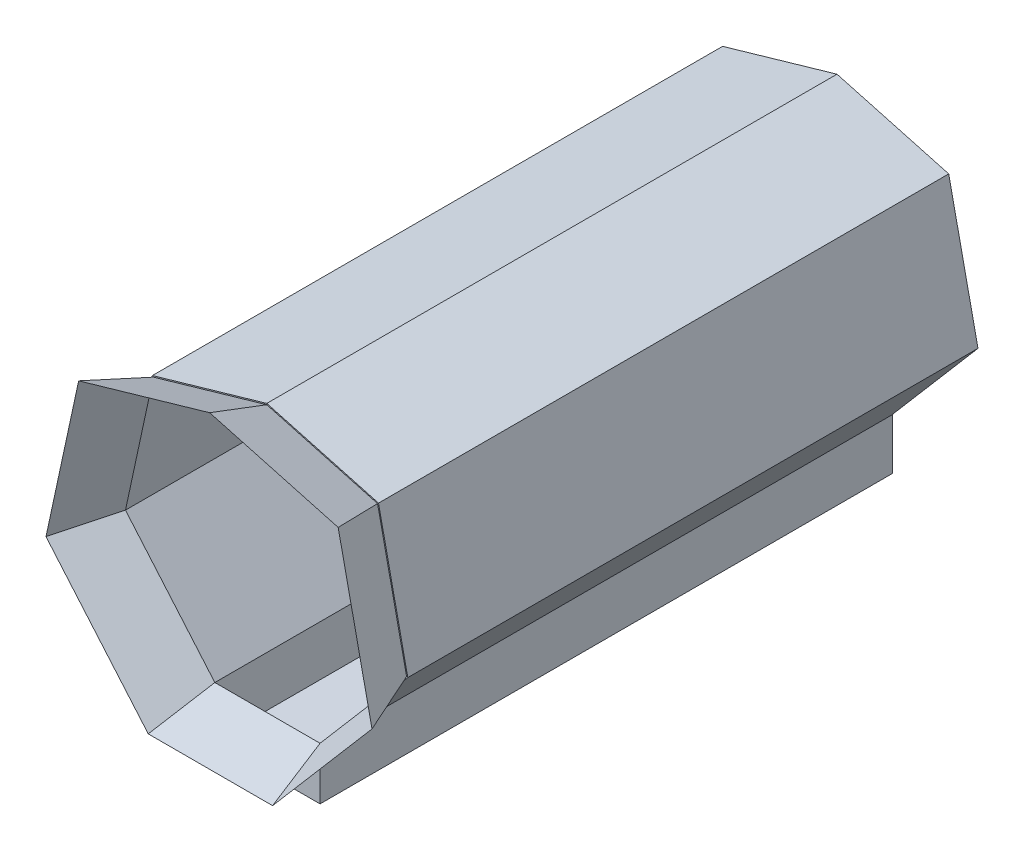
ISO-10303-21;
HEADER;
FILE_DESCRIPTION(('STEP AP214'),'2;1');
FILE_NAME('part.step','',(''),(''),'','','');
FILE_SCHEMA(('AUTOMOTIVE_DESIGN { 1 0 10303 214 1 1 1 1 }'));
ENDSEC;
DATA;
#1=APPLICATION_CONTEXT('core data for automotive mechanical design processes');
#2=APPLICATION_PROTOCOL_DEFINITION('international standard','automotive_design',2000,#1);
#3=PRODUCT_CONTEXT('',#1,'mechanical');
#4=PRODUCT('Part','Part','',(#3));
#5=PRODUCT_RELATED_PRODUCT_CATEGORY('part','',(#4));
#6=PRODUCT_DEFINITION_FORMATION('','',#4);
#7=PRODUCT_DEFINITION_CONTEXT('part definition',#1,'design');
#8=PRODUCT_DEFINITION('design','',#6,#7);
#9=PRODUCT_DEFINITION_SHAPE('','',#8);
#10=(LENGTH_UNIT() NAMED_UNIT(*) SI_UNIT(.MILLI.,.METRE.));
#11=(NAMED_UNIT(*) PLANE_ANGLE_UNIT() SI_UNIT($,.RADIAN.));
#12=(NAMED_UNIT(*) SI_UNIT($,.STERADIAN.) SOLID_ANGLE_UNIT());
#13=UNCERTAINTY_MEASURE_WITH_UNIT(LENGTH_MEASURE(1.E-05),#10,'distance_accuracy_value','');
#14=(GEOMETRIC_REPRESENTATION_CONTEXT(3) GLOBAL_UNCERTAINTY_ASSIGNED_CONTEXT((#13)) GLOBAL_UNIT_ASSIGNED_CONTEXT((#10,
#11,#12)) REPRESENTATION_CONTEXT('',''));
#15=CARTESIAN_POINT('',(0.,0.,0.));
#16=DIRECTION('',(0.,0.,1.));
#17=DIRECTION('',(1.,0.,0.));
#18=AXIS2_PLACEMENT_3D('',#15,#16,#17);
#19=CARTESIAN_POINT('',(2670.63100520292,1349.34074992403,5000.));
#20=DIRECTION('',(0.713921634132944,-0.611014011194862,-0.342020143325669));
#21=DIRECTION('',(0.650227529384921,0.75973953433396,0.));
#22=AXIS2_PLACEMENT_3D('',#19,#20,#21);
#23=PLANE('',#22);
#24=DIRECTION('',(-0.650227529384921,-0.75973953433396,0.));
#25=VECTOR('',#24,1.);
#26=CARTESIAN_POINT('',(2670.63100520292,1349.34074992403,5000.));
#27=LINE('',#26,#25);
#28=CARTESIAN_POINT('',(2670.63100520292,1349.34074992403,5000.));
#29=VERTEX_POINT('',#28);
#30=CARTESIAN_POINT('',(1911.88754105933,462.808912872056,5000.));
#31=VERTEX_POINT('',#30);
#32=EDGE_CURVE('E178',#29,#31,#27,.T.);
#33=ORIENTED_EDGE('',*,*,#32,.F.);
#34=DIRECTION('',(-0.36474440443504,0.0924449784311128,-0.9265071210715));
#35=VECTOR('',#34,1.);
#36=CARTESIAN_POINT('',(2596.78551169436,1368.05699333072,4812.42104124753));
#37=LINE('',#36,#35);
#38=CARTESIAN_POINT('',(2867.46942993797,1299.45177641879,5500.));
#39=VERTEX_POINT('',#38);
#40=EDGE_CURVE('E13',#39,#29,#37,.T.);
#41=ORIENTED_EDGE('',*,*,#40,.F.);
#42=DIRECTION('',(-0.650227529384921,-0.75973953433396,0.));
#43=VECTOR('',#42,1.);
#44=CARTESIAN_POINT('',(1013.18147961817,-867.137302375915,5500.));
#45=LINE('',#44,#43);
#46=CARTESIAN_POINT('',(1995.6707077345,280.823795738955,5500.));
#47=VERTEX_POINT('',#46);
#48=EDGE_CURVE('E184',#39,#47,#45,.T.);
#49=ORIENTED_EDGE('',*,*,#48,.T.);
#50=DIRECTION('',(-0.15554437613408,0.337857383928939,-0.928255533340768));
#51=VECTOR('',#50,1.);
#52=CARTESIAN_POINT('',(1883.65576262018,524.131057999904,4831.51879094872));
#53=LINE('',#52,#51);
#54=EDGE_CURVE('E173',#47,#31,#53,.T.);
#55=ORIENTED_EDGE('',*,*,#54,.T.);
#56=EDGE_LOOP('',(#33,#41,#49,#55));
#57=FACE_BOUND('',#56,.T.);
#58=ADVANCED_FACE('F107',(#57),#23,.T.);
#59=CARTESIAN_POINT('',(2416.10612923576,2535.14523468048,5000.));
#60=DIRECTION('',(0.918766367009611,0.197206958324114,-0.342020143325669));
#61=DIRECTION('',(-0.348871320206438,0.,-0.937170636510458));
#62=AXIS2_PLACEMENT_3D('',#59,#60,#61);
#63=PLANE('',#62);
#64=DIRECTION('',(0.209863261626106,-0.977730745870075,0.));
#65=VECTOR('',#64,1.);
#66=CARTESIAN_POINT('',(2416.10612923576,2535.14523468048,5000.));
#67=LINE('',#66,#65);
#68=CARTESIAN_POINT('',(2416.10612923576,2535.14523468048,5000.));
#69=VERTEX_POINT('',#68);
#70=EDGE_CURVE('E150',#69,#29,#67,.T.);
#71=ORIENTED_EDGE('',*,*,#70,.F.);
#72=DIRECTION('',(-0.284651116859296,-0.269408804401264,-0.919995998785776));
#73=VECTOR('',#72,1.);
#74=CARTESIAN_POINT('',(2357.75316131961,2479.91691345338,4811.40247193664));
#75=LINE('',#74,#73);
#76=CARTESIAN_POINT('',(2570.8084960042,2681.56369995469,5500.));
#77=VERTEX_POINT('',#76);
#78=EDGE_CURVE('E115',#77,#69,#75,.T.);
#79=ORIENTED_EDGE('',*,*,#78,.F.);
#80=DIRECTION('',(0.209863261626106,-0.977730745870075,0.));
#81=VECTOR('',#80,1.);
#82=CARTESIAN_POINT('',(3007.81285601815,645.606593626322,5500.));
#83=LINE('',#82,#81);
#84=EDGE_CURVE('E123',#77,#39,#83,.T.);
#85=ORIENTED_EDGE('',*,*,#84,.T.);
#86=ORIENTED_EDGE('',*,*,#40,.T.);
#87=EDGE_LOOP('',(#71,#79,#85,#86));
#88=FACE_BOUND('',#87,.T.);
#89=ADVANCED_FACE('F108',(#88),#63,.T.);
#90=CARTESIAN_POINT('',(1445.1079348741,2800.16075996232,5000.));
#91=DIRECTION('',(0.247421394903269,0.906534541484002,-0.342020143325669));
#92=DIRECTION('',(0.,0.352995489865948,0.935625023251462));
#93=AXIS2_PLACEMENT_3D('',#90,#91,#92);
#94=PLANE('',#93);
#95=DIRECTION('',(0.964713909028918,-0.263300348891044,0.));
#96=VECTOR('',#95,1.);
#97=CARTESIAN_POINT('',(1445.1079348741,2800.16075996232,5000.));
#98=LINE('',#97,#96);
#99=CARTESIAN_POINT('',(1445.1079348741,2800.16075996232,5000.));
#100=VERTEX_POINT('',#99);
#101=EDGE_CURVE('E242',#100,#69,#98,.T.);
#102=ORIENTED_EDGE('',*,*,#101,.F.);
#103=DIRECTION('',(0.00267031261497397,-0.353632146298872,-0.935380764466852));
#104=VECTOR('',#103,1.);
#105=CARTESIAN_POINT('',(1445.3725852174,2765.11285268919,4907.29593267689));
#106=LINE('',#105,#104);
#107=CARTESIAN_POINT('',(1443.68054149784,2989.19187955159,5500.));
#108=VERTEX_POINT('',#107);
#109=EDGE_CURVE('E198',#108,#100,#106,.T.);
#110=ORIENTED_EDGE('',*,*,#109,.F.);
#111=DIRECTION('',(0.964713909028918,-0.263300348891044,0.));
#112=VECTOR('',#111,1.);
#113=CARTESIAN_POINT('',(859.369308453044,3148.6685389858,5500.));
#114=LINE('',#113,#112);
#115=EDGE_CURVE('E189',#108,#77,#114,.T.);
#116=ORIENTED_EDGE('',*,*,#115,.T.);
#117=ORIENTED_EDGE('',*,*,#78,.T.);
#118=EDGE_LOOP('',(#102,#110,#116,#117));
#119=FACE_BOUND('',#118,.T.);
#120=ADVANCED_FACE('F252',(#119),#94,.T.);
#121=CARTESIAN_POINT('',(450.137888663884,2512.38925258013,5000.));
#122=DIRECTION('',(-0.261083071054589,0.902694772095304,-0.342020143325669));
#123=DIRECTION('',(0.,0.354308872959638,0.935128452428901));
#124=AXIS2_PLACEMENT_3D('',#121,#122,#123);
#125=PLANE('',#124);
#126=DIRECTION('',(0.960627711794032,0.277838800986043,0.));
#127=VECTOR('',#126,1.);
#128=CARTESIAN_POINT('',(450.137888663884,2512.38925258013,5000.));
#129=LINE('',#128,#127);
#130=CARTESIAN_POINT('',(450.137888663884,2512.38925258013,5000.));
#131=VERTEX_POINT('',#130);
#132=EDGE_CURVE('E236',#131,#100,#129,.T.);
#133=ORIENTED_EDGE('',*,*,#132,.F.);
#134=DIRECTION('',(0.285327923975842,-0.266313006622187,-0.920687437898165));
#135=VECTOR('',#134,1.);
#136=CARTESIAN_POINT('',(516.283222606123,2450.6519977376,4786.56425495405));
#137=LINE('',#136,#135);
#138=CARTESIAN_POINT('',(295.184148539431,2657.01651459108,5500.));
#139=VERTEX_POINT('',#138);
#140=EDGE_CURVE('E195',#139,#131,#137,.T.);
#141=ORIENTED_EDGE('',*,*,#140,.F.);
#142=DIRECTION('',(0.960627711794032,0.277838800986043,0.));
#143=VECTOR('',#142,1.);
#144=CARTESIAN_POINT('',(-686.370219103721,2373.12517431393,5500.));
#145=LINE('',#144,#143);
#146=EDGE_CURVE('E207',#139,#108,#145,.T.);
#147=ORIENTED_EDGE('',*,*,#146,.T.);
#148=ORIENTED_EDGE('',*,*,#109,.T.);
#149=EDGE_LOOP('',(#133,#141,#147,#148));
#150=FACE_BOUND('',#149,.T.);
#151=ADVANCED_FACE('F259',(#150),#125,.T.);
#152=CARTESIAN_POINT('',(205.652000000002,1379.95937649793,5000.));
#153=DIRECTION('',(-0.918529790147402,0.198305940837025,-0.342020143325669));
#154=DIRECTION('',(-0.348950235506643,0.,0.937141255702607));
#155=AXIS2_PLACEMENT_3D('',#152,#153,#154);
#156=PLANE('',#155);
#157=DIRECTION('',(0.211032774388685,0.97747898603183,0.));
#158=VECTOR('',#157,1.);
#159=CARTESIAN_POINT('',(205.652000000002,1379.95937649793,5000.));
#160=LINE('',#159,#158);
#161=CARTESIAN_POINT('',(205.652000000002,1379.95937649793,5000.));
#162=VERTEX_POINT('',#161);
#163=EDGE_CURVE('E230',#162,#131,#160,.T.);
#164=ORIENTED_EDGE('',*,*,#163,.F.);
#165=DIRECTION('',(0.364864658226524,0.0920721626514925,-0.926496895861999));
#166=VECTOR('',#165,1.);
#167=CARTESIAN_POINT('',(279.152281978216,1398.50688381235,4813.36152580851));
#168=LINE('',#167,#166);
#169=CARTESIAN_POINT('',(8.74650584448322,1330.27104885068,5500.));
#170=VERTEX_POINT('',#169);
#171=EDGE_CURVE('E186',#170,#162,#168,.T.);
#172=ORIENTED_EDGE('',*,*,#171,.F.);
#173=DIRECTION('',(0.211032774388685,0.97747898603183,0.));
#174=VECTOR('',#173,1.);
#175=CARTESIAN_POINT('',(-266.051466404858,57.4391673763993,5500.));
#176=LINE('',#175,#174);
#177=EDGE_CURVE('E210',#170,#139,#176,.T.);
#178=ORIENTED_EDGE('',*,*,#177,.T.);
#179=ORIENTED_EDGE('',*,*,#140,.T.);
#180=EDGE_LOOP('',(#164,#172,#178,#179));
#181=FACE_BOUND('',#180,.T.);
#182=ADVANCED_FACE('F269',(#181),#156,.T.);
#183=CARTESIAN_POINT('',(989.201054635925,462.808912872056,5000.));
#184=DIRECTION('',(-0.7144599399812,-0.610384481881338,-0.342020143325669));
#185=DIRECTION('',(0.649557598282346,-0.760312387452467,0.));
#186=AXIS2_PLACEMENT_3D('',#183,#184,#185);
#187=PLANE('',#186);
#188=DIRECTION('',(-0.649557598282346,0.760312387452467,0.));
#189=VECTOR('',#188,1.);
#190=CARTESIAN_POINT('',(989.201054635925,462.808912872056,5000.));
#191=LINE('',#190,#189);
#192=CARTESIAN_POINT('',(989.201054635925,462.808912872056,5000.));
#193=VERTEX_POINT('',#192);
#194=EDGE_CURVE('E177',#193,#162,#191,.T.);
#195=ORIENTED_EDGE('',*,*,#194,.F.);
#196=DIRECTION('',(0.155720502589393,0.337847893173696,-0.928229457705045));
#197=VECTOR('',#196,1.);
#198=CARTESIAN_POINT('',(1011.57516384176,511.351304728831,4866.63087448719));
#199=LINE('',#198,#197);
#200=CARTESIAN_POINT('',(905.320662079543,280.823795738955,5500.));
#201=VERTEX_POINT('',#200);
#202=EDGE_CURVE('E175',#201,#193,#199,.T.);
#203=ORIENTED_EDGE('',*,*,#202,.F.);
#204=DIRECTION('',(-0.649557598282346,0.760312387452467,0.));
#205=VECTOR('',#204,1.);
#206=CARTESIAN_POINT('',(662.032693211028,565.594317919005,5500.));
#207=LINE('',#206,#205);
#208=EDGE_CURVE('E212',#201,#170,#207,.T.);
#209=ORIENTED_EDGE('',*,*,#208,.T.);
#210=ORIENTED_EDGE('',*,*,#171,.T.);
#211=EDGE_LOOP('',(#195,#203,#209,#210));
#212=FACE_BOUND('',#211,.T.);
#213=ADVANCED_FACE('F266',(#212),#187,.T.);
#214=CARTESIAN_POINT('',(1911.88754105933,462.808912872056,5000.));
#215=DIRECTION('',(0.,-0.939692620785908,-0.342020143325669));
#216=DIRECTION('',(0.,0.342020143325669,-0.939692620785908));
#217=AXIS2_PLACEMENT_3D('',#214,#215,#216);
#218=PLANE('',#217);
#219=DIRECTION('',(-1.,0.,0.));
#220=VECTOR('',#219,1.);
#221=CARTESIAN_POINT('',(1911.88754105933,462.808912872056,5000.));
#222=LINE('',#221,#220);
#223=EDGE_CURVE('E169',#31,#193,#222,.T.);
#224=ORIENTED_EDGE('',*,*,#223,.F.);
#225=ORIENTED_EDGE('',*,*,#54,.F.);
#226=DIRECTION('',(-1.,0.,0.));
#227=VECTOR('',#226,1.);
#228=CARTESIAN_POINT('',(0.,280.823795738955,5500.));
#229=LINE('',#228,#227);
#230=EDGE_CURVE('E110',#47,#201,#229,.T.);
#231=ORIENTED_EDGE('',*,*,#230,.T.);
#232=ORIENTED_EDGE('',*,*,#202,.T.);
#233=EDGE_LOOP('',(#224,#225,#231,#232));
#234=FACE_BOUND('',#233,.T.);
#235=ADVANCED_FACE('F171',(#234),#218,.T.);
#236=OPEN_SHELL('',(#58,#89,#120,#151,#182,#213,#235));
#237=SHELL_BASED_SURFACE_MODEL('B2',(#236));
#238=CARTESIAN_POINT('',(0.,0.,5000.));
#239=DIRECTION('',(0.,0.,-1.));
#240=DIRECTION('',(-1.,0.,0.));
#241=AXIS2_PLACEMENT_3D('',#238,#239,#240);
#242=PLANE('',#241);
#243=DIRECTION('',(-1.,0.,0.));
#244=VECTOR('',#243,1.);
#245=CARTESIAN_POINT('',(979.201054635925,459.1138914402,5000.));
#246=LINE('',#245,#244);
#247=CARTESIAN_POINT('',(1921.88754105933,459.1138914402,5000.));
#248=VERTEX_POINT('',#247);
#249=CARTESIAN_POINT('',(1911.88754105933,459.1138914402,5000.));
#250=VERTEX_POINT('',#249);
#251=EDGE_CURVE('E555',#248,#250,#246,.T.);
#252=ORIENTED_EDGE('',*,*,#251,.F.);
#253=DIRECTION('',(0.650227529384921,0.75973953433396,0.));
#254=VECTOR('',#253,1.);
#255=CARTESIAN_POINT('',(882.5175868151,-755.307844571482,5000.));
#256=LINE('',#255,#254);
#257=CARTESIAN_POINT('',(2681.44718774773,1346.59937336032,5000.));
#258=VERTEX_POINT('',#257);
#259=EDGE_CURVE('E687',#248,#258,#256,.T.);
#260=ORIENTED_EDGE('',*,*,#259,.T.);
#261=DIRECTION('',(-0.209863261626106,0.977730745870075,0.));
#262=VECTOR('',#261,1.);
#263=CARTESIAN_POINT('',(2839.65771916505,609.513235993622,5000.));
#264=LINE('',#263,#262);
#265=CARTESIAN_POINT('',(2424.60695442441,2543.19086322312,5000.));
#266=VERTEX_POINT('',#265);
#267=EDGE_CURVE('E690',#258,#266,#264,.T.);
#268=ORIENTED_EDGE('',*,*,#267,.T.);
#269=DIRECTION('',(-0.964713909028918,0.263300348891043,0.));
#270=VECTOR('',#269,1.);
#271=CARTESIAN_POINT('',(814.08556710783,2982.75210434153,5000.));
#272=LINE('',#271,#270);
#273=CARTESIAN_POINT('',(1445.0295002527,2810.54793461524,5000.));
#274=VERTEX_POINT('',#273);
#275=EDGE_CURVE('E693',#266,#274,#272,.T.);
#276=ORIENTED_EDGE('',*,*,#275,.T.);
#277=DIRECTION('',(-0.960627711794032,-0.277838800986043,0.));
#278=VECTOR('',#277,1.);
#279=CARTESIAN_POINT('',(-638.586080372016,2207.91150477973,5000.));
#280=LINE('',#279,#278);
#281=CARTESIAN_POINT('',(441.623250622844,2520.33645531238,5000.));
#282=VERTEX_POINT('',#281);
#283=EDGE_CURVE('E673',#274,#282,#280,.T.);
#284=ORIENTED_EDGE('',*,*,#283,.T.);
#285=DIRECTION('',(-0.211032774388686,-0.97747898603183,0.));
#286=VECTOR('',#285,1.);
#287=CARTESIAN_POINT('',(-97.9396284970289,21.1446709542379,5000.));
#288=LINE('',#287,#286);
#289=CARTESIAN_POINT('',(194.832132020825,1377.2290253335,5000.));
#290=VERTEX_POINT('',#289);
#291=EDGE_CURVE('E677',#282,#290,#288,.T.);
#292=ORIENTED_EDGE('',*,*,#291,.T.);
#293=DIRECTION('',(0.649557598282346,-0.760312387452467,0.));
#294=VECTOR('',#293,1.);
#295=CARTESIAN_POINT('',(792.795108224788,677.30855754429,5000.));
#296=LINE('',#295,#294);
#297=CARTESIAN_POINT('',(979.201054635925,459.118899651037,5000.));
#298=VERTEX_POINT('',#297);
#299=EDGE_CURVE('E681',#290,#298,#296,.T.);
#300=ORIENTED_EDGE('',*,*,#299,.T.);
#301=DIRECTION('',(0.,-1.,0.));
#302=VECTOR('',#301,1.);
#303=CARTESIAN_POINT('',(979.201054635925,2.46758430600655E-13,5000.));
#304=LINE('',#303,#302);
#305=CARTESIAN_POINT('',(979.201054635925,459.1138914402,5000.));
#306=VERTEX_POINT('',#305);
#307=EDGE_CURVE('E684',#298,#306,#304,.T.);
#308=ORIENTED_EDGE('',*,*,#307,.T.);
#309=CARTESIAN_POINT('',(989.201054635925,459.1138914402,5000.));
#310=VERTEX_POINT('',#309);
#311=EDGE_CURVE('E353',#310,#306,#246,.T.);
#312=ORIENTED_EDGE('',*,*,#311,.F.);
#313=DIRECTION('',(0.,-1.,0.));
#314=VECTOR('',#313,1.);
#315=CARTESIAN_POINT('',(989.201054635925,462.808912872056,5000.));
#316=LINE('',#315,#314);
#317=CARTESIAN_POINT('',(989.201054635925,462.808912872056,5000.));
#318=VERTEX_POINT('',#317);
#319=EDGE_CURVE('E586',#318,#310,#316,.T.);
#320=ORIENTED_EDGE('',*,*,#319,.F.);
#321=DIRECTION('',(0.649557598282346,-0.760312387452467,0.));
#322=VECTOR('',#321,1.);
#323=CARTESIAN_POINT('',(205.652000000002,1379.95937649793,5000.));
#324=LINE('',#323,#322);
#325=CARTESIAN_POINT('',(205.652000000002,1379.95937649793,5000.));
#326=VERTEX_POINT('',#325);
#327=EDGE_CURVE('E582',#326,#318,#324,.T.);
#328=ORIENTED_EDGE('',*,*,#327,.F.);
#329=DIRECTION('',(-0.211032774388685,-0.97747898603183,0.));
#330=VECTOR('',#329,1.);
#331=CARTESIAN_POINT('',(450.137888663884,2512.38925258013,5000.));
#332=LINE('',#331,#330);
#333=CARTESIAN_POINT('',(450.137888663884,2512.38925258013,5000.));
#334=VERTEX_POINT('',#333);
#335=EDGE_CURVE('E578',#334,#326,#332,.T.);
#336=ORIENTED_EDGE('',*,*,#335,.F.);
#337=DIRECTION('',(-0.960627711794032,-0.277838800986043,0.));
#338=VECTOR('',#337,1.);
#339=CARTESIAN_POINT('',(1445.1079348741,2800.16075996232,5000.));
#340=LINE('',#339,#338);
#341=CARTESIAN_POINT('',(1445.1079348741,2800.16075996232,5000.));
#342=VERTEX_POINT('',#341);
#343=EDGE_CURVE('E575',#342,#334,#340,.T.);
#344=ORIENTED_EDGE('',*,*,#343,.F.);
#345=DIRECTION('',(-0.964713909028918,0.263300348891043,0.));
#346=VECTOR('',#345,1.);
#347=CARTESIAN_POINT('',(2416.10612923576,2535.14523468048,5000.));
#348=LINE('',#347,#346);
#349=CARTESIAN_POINT('',(2416.10612923576,2535.14523468048,5000.));
#350=VERTEX_POINT('',#349);
#351=EDGE_CURVE('E605',#350,#342,#348,.T.);
#352=ORIENTED_EDGE('',*,*,#351,.F.);
#353=DIRECTION('',(-0.209863261626106,0.977730745870075,0.));
#354=VECTOR('',#353,1.);
#355=CARTESIAN_POINT('',(2670.63100520292,1349.34074992403,5000.));
#356=LINE('',#355,#354);
#357=CARTESIAN_POINT('',(2670.63100520292,1349.34074992403,5000.));
#358=VERTEX_POINT('',#357);
#359=EDGE_CURVE('E601',#358,#350,#356,.T.);
#360=ORIENTED_EDGE('',*,*,#359,.F.);
#361=DIRECTION('',(0.650227529384921,0.75973953433396,0.));
#362=VECTOR('',#361,1.);
#363=CARTESIAN_POINT('',(1911.88754105933,462.808912872056,5000.));
#364=LINE('',#363,#362);
#365=CARTESIAN_POINT('',(1911.88754105933,462.808912872056,5000.));
#366=VERTEX_POINT('',#365);
#367=EDGE_CURVE('E598',#366,#358,#364,.T.);
#368=ORIENTED_EDGE('',*,*,#367,.F.);
#369=DIRECTION('',(0.,1.,0.));
#370=VECTOR('',#369,1.);
#371=CARTESIAN_POINT('',(1911.88754105933,22.2438006901692,5000.));
#372=LINE('',#371,#370);
#373=EDGE_CURVE('E593',#250,#366,#372,.T.);
#374=ORIENTED_EDGE('',*,*,#373,.F.);
#375=EDGE_LOOP('',(#252,#260,#268,#276,#284,#292,#300,#308,#312,#320,#328,#336,#344,#352,#360,
#368,#374));
#376=FACE_BOUND('',#375,.T.);
#377=ADVANCED_FACE('F343',(#376),#242,.F.);
#378=CARTESIAN_POINT('',(0.,0.,0.));
#379=DIRECTION('',(0.,0.,-1.));
#380=DIRECTION('',(-1.,0.,0.));
#381=AXIS2_PLACEMENT_3D('',#378,#379,#380);
#382=PLANE('',#381);
#383=DIRECTION('',(1.,0.,0.));
#384=VECTOR('',#383,1.);
#385=CARTESIAN_POINT('',(1921.88754105933,459.118899651037,0.));
#386=LINE('',#385,#384);
#387=CARTESIAN_POINT('',(979.201054635925,459.118899651037,0.));
#388=VERTEX_POINT('',#387);
#389=CARTESIAN_POINT('',(989.201054635925,459.118899651037,0.));
#390=VERTEX_POINT('',#389);
#391=EDGE_CURVE('E355',#388,#390,#386,.T.);
#392=ORIENTED_EDGE('',*,*,#391,.F.);
#393=DIRECTION('',(0.649557598282346,-0.760312387452467,0.));
#394=VECTOR('',#393,1.);
#395=CARTESIAN_POINT('',(792.795108224788,677.30855754429,0.));
#396=LINE('',#395,#394);
#397=CARTESIAN_POINT('',(194.832132020825,1377.2290253335,0.));
#398=VERTEX_POINT('',#397);
#399=EDGE_CURVE('E703',#398,#388,#396,.T.);
#400=ORIENTED_EDGE('',*,*,#399,.F.);
#401=DIRECTION('',(-0.211032774388686,-0.97747898603183,0.));
#402=VECTOR('',#401,1.);
#403=CARTESIAN_POINT('',(-97.9396284970289,21.1446709542379,0.));
#404=LINE('',#403,#402);
#405=CARTESIAN_POINT('',(441.623250622844,2520.33645531238,0.));
#406=VERTEX_POINT('',#405);
#407=EDGE_CURVE('E700',#406,#398,#404,.T.);
#408=ORIENTED_EDGE('',*,*,#407,.F.);
#409=DIRECTION('',(-0.960627711794032,-0.277838800986043,0.));
#410=VECTOR('',#409,1.);
#411=CARTESIAN_POINT('',(-638.586080372016,2207.91150477973,0.));
#412=LINE('',#411,#410);
#413=CARTESIAN_POINT('',(1445.0295002527,2810.54793461524,0.));
#414=VERTEX_POINT('',#413);
#415=EDGE_CURVE('E672',#414,#406,#412,.T.);
#416=ORIENTED_EDGE('',*,*,#415,.F.);
#417=DIRECTION('',(-0.964713909028918,0.263300348891043,0.));
#418=VECTOR('',#417,1.);
#419=CARTESIAN_POINT('',(814.08556710783,2982.75210434153,0.));
#420=LINE('',#419,#418);
#421=CARTESIAN_POINT('',(2424.60695442441,2543.19086322312,0.));
#422=VERTEX_POINT('',#421);
#423=EDGE_CURVE('E678',#422,#414,#420,.T.);
#424=ORIENTED_EDGE('',*,*,#423,.F.);
#425=DIRECTION('',(-0.209863261626106,0.977730745870075,0.));
#426=VECTOR('',#425,1.);
#427=CARTESIAN_POINT('',(2839.65771916505,609.513235993622,0.));
#428=LINE('',#427,#426);
#429=CARTESIAN_POINT('',(2681.44718774773,1346.59937336032,0.));
#430=VERTEX_POINT('',#429);
#431=EDGE_CURVE('E710',#430,#422,#428,.T.);
#432=ORIENTED_EDGE('',*,*,#431,.F.);
#433=DIRECTION('',(0.650227529384921,0.75973953433396,0.));
#434=VECTOR('',#433,1.);
#435=CARTESIAN_POINT('',(882.5175868151,-755.307844571482,0.));
#436=LINE('',#435,#434);
#437=CARTESIAN_POINT('',(1921.88754105933,459.1138914402,0.));
#438=VERTEX_POINT('',#437);
#439=EDGE_CURVE('E707',#438,#430,#436,.T.);
#440=ORIENTED_EDGE('',*,*,#439,.F.);
#441=DIRECTION('',(0.,-1.,0.));
#442=VECTOR('',#441,1.);
#443=CARTESIAN_POINT('',(1921.88754105933,12.2438006901692,0.));
#444=LINE('',#443,#442);
#445=CARTESIAN_POINT('',(1921.88754105933,459.118899651037,0.));
#446=VERTEX_POINT('',#445);
#447=EDGE_CURVE('E539',#446,#438,#444,.T.);
#448=ORIENTED_EDGE('',*,*,#447,.F.);
#449=CARTESIAN_POINT('',(1911.88754105933,459.118899651037,0.));
#450=VERTEX_POINT('',#449);
#451=EDGE_CURVE('E105',#450,#446,#386,.T.);
#452=ORIENTED_EDGE('',*,*,#451,.F.);
#453=DIRECTION('',(0.,1.,0.));
#454=VECTOR('',#453,1.);
#455=CARTESIAN_POINT('',(1911.88754105933,22.2438006901692,0.));
#456=LINE('',#455,#454);
#457=CARTESIAN_POINT('',(1911.88754105933,462.808912872056,0.));
#458=VERTEX_POINT('',#457);
#459=EDGE_CURVE('E627',#450,#458,#456,.T.);
#460=ORIENTED_EDGE('',*,*,#459,.T.);
#461=DIRECTION('',(0.650227529384921,0.75973953433396,0.));
#462=VECTOR('',#461,1.);
#463=CARTESIAN_POINT('',(1911.88754105933,462.808912872056,0.));
#464=LINE('',#463,#462);
#465=CARTESIAN_POINT('',(2670.63100520292,1349.34074992403,0.));
#466=VERTEX_POINT('',#465);
#467=EDGE_CURVE('E632',#458,#466,#464,.T.);
#468=ORIENTED_EDGE('',*,*,#467,.T.);
#469=DIRECTION('',(-0.209863261626106,0.977730745870075,0.));
#470=VECTOR('',#469,1.);
#471=CARTESIAN_POINT('',(2670.63100520292,1349.34074992403,0.));
#472=LINE('',#471,#470);
#473=CARTESIAN_POINT('',(2416.10612923576,2535.14523468048,0.));
#474=VERTEX_POINT('',#473);
#475=EDGE_CURVE('E636',#466,#474,#472,.T.);
#476=ORIENTED_EDGE('',*,*,#475,.T.);
#477=DIRECTION('',(-0.964713909028918,0.263300348891043,0.));
#478=VECTOR('',#477,1.);
#479=CARTESIAN_POINT('',(2416.10612923576,2535.14523468048,0.));
#480=LINE('',#479,#478);
#481=CARTESIAN_POINT('',(1445.1079348741,2800.16075996232,0.));
#482=VERTEX_POINT('',#481);
#483=EDGE_CURVE('E579',#474,#482,#480,.T.);
#484=ORIENTED_EDGE('',*,*,#483,.T.);
#485=DIRECTION('',(-0.960627711794032,-0.277838800986043,0.));
#486=VECTOR('',#485,1.);
#487=CARTESIAN_POINT('',(1445.1079348741,2800.16075996232,0.));
#488=LINE('',#487,#486);
#489=CARTESIAN_POINT('',(450.137888663884,2512.38925258013,0.));
#490=VERTEX_POINT('',#489);
#491=EDGE_CURVE('E574',#482,#490,#488,.T.);
#492=ORIENTED_EDGE('',*,*,#491,.T.);
#493=DIRECTION('',(-0.211032774388685,-0.97747898603183,0.));
#494=VECTOR('',#493,1.);
#495=CARTESIAN_POINT('',(450.137888663884,2512.38925258013,0.));
#496=LINE('',#495,#494);
#497=CARTESIAN_POINT('',(205.652000000002,1379.95937649793,0.));
#498=VERTEX_POINT('',#497);
#499=EDGE_CURVE('E612',#490,#498,#496,.T.);
#500=ORIENTED_EDGE('',*,*,#499,.T.);
#501=DIRECTION('',(0.649557598282346,-0.760312387452467,0.));
#502=VECTOR('',#501,1.);
#503=CARTESIAN_POINT('',(205.652000000002,1379.95937649793,0.));
#504=LINE('',#503,#502);
#505=CARTESIAN_POINT('',(989.201054635925,462.808912872056,0.));
#506=VERTEX_POINT('',#505);
#507=EDGE_CURVE('E616',#498,#506,#504,.T.);
#508=ORIENTED_EDGE('',*,*,#507,.T.);
#509=DIRECTION('',(0.,-1.,0.));
#510=VECTOR('',#509,1.);
#511=CARTESIAN_POINT('',(989.201054635925,462.808912872056,0.));
#512=LINE('',#511,#510);
#513=EDGE_CURVE('E620',#506,#390,#512,.T.);
#514=ORIENTED_EDGE('',*,*,#513,.T.);
#515=EDGE_LOOP('',(#392,#400,#408,#416,#424,#432,#440,#448,#452,#460,#468,#476,#484,#492,#500,
#508,#514));
#516=FACE_BOUND('',#515,.T.);
#517=ADVANCED_FACE('F771',(#516),#382,.T.);
#518=CARTESIAN_POINT('',(-638.586080372016,2207.91150477973,5000.));
#519=DIRECTION('',(0.277838800986043,-0.960627711794032,0.));
#520=DIRECTION('',(0.960627711794032,0.277838800986043,0.));
#521=AXIS2_PLACEMENT_3D('',#518,#519,#520);
#522=PLANE('',#521);
#523=ORIENTED_EDGE('',*,*,#415,.T.);
#524=DIRECTION('',(0.,0.,-1.));
#525=VECTOR('',#524,1.);
#526=CARTESIAN_POINT('',(441.623250622844,2520.33645531238,5000.));
#527=LINE('',#526,#525);
#528=EDGE_CURVE('E347',#282,#406,#527,.T.);
#529=ORIENTED_EDGE('',*,*,#528,.F.);
#530=ORIENTED_EDGE('',*,*,#283,.F.);
#531=DIRECTION('',(0.,0.,-1.));
#532=VECTOR('',#531,1.);
#533=CARTESIAN_POINT('',(1445.0295002527,2810.54793461524,5000.));
#534=LINE('',#533,#532);
#535=EDGE_CURVE('E696',#274,#414,#534,.T.);
#536=ORIENTED_EDGE('',*,*,#535,.T.);
#537=EDGE_LOOP('',(#523,#529,#530,#536));
#538=FACE_BOUND('',#537,.T.);
#539=ADVANCED_FACE('F345',(#538),#522,.F.);
#540=CARTESIAN_POINT('',(-97.9396284970289,21.1446709542379,5000.));
#541=DIRECTION('',(0.97747898603183,-0.211032774388685,0.));
#542=DIRECTION('',(0.211032774388686,0.97747898603183,0.));
#543=AXIS2_PLACEMENT_3D('',#540,#541,#542);
#544=PLANE('',#543);
#545=ORIENTED_EDGE('',*,*,#407,.T.);
#546=DIRECTION('',(0.,0.,-1.));
#547=VECTOR('',#546,1.);
#548=CARTESIAN_POINT('',(194.832132020825,1377.2290253335,5000.));
#549=LINE('',#548,#547);
#550=EDGE_CURVE('E733',#290,#398,#549,.T.);
#551=ORIENTED_EDGE('',*,*,#550,.F.);
#552=ORIENTED_EDGE('',*,*,#291,.F.);
#553=ORIENTED_EDGE('',*,*,#528,.T.);
#554=EDGE_LOOP('',(#545,#551,#552,#553));
#555=FACE_BOUND('',#554,.T.);
#556=ADVANCED_FACE('F781',(#555),#544,.F.);
#557=CARTESIAN_POINT('',(792.795108224788,677.30855754429,5000.));
#558=DIRECTION('',(0.760312387452467,0.649557598282346,0.));
#559=DIRECTION('',(-0.649557598282346,0.760312387452467,0.));
#560=AXIS2_PLACEMENT_3D('',#557,#558,#559);
#561=PLANE('',#560);
#562=ORIENTED_EDGE('',*,*,#399,.T.);
#563=DIRECTION('',(0.,0.,-1.));
#564=VECTOR('',#563,1.);
#565=CARTESIAN_POINT('',(979.201054635925,459.118899651037,5000.));
#566=LINE('',#565,#564);
#567=EDGE_CURVE('E730',#298,#388,#566,.T.);
#568=ORIENTED_EDGE('',*,*,#567,.F.);
#569=ORIENTED_EDGE('',*,*,#299,.F.);
#570=ORIENTED_EDGE('',*,*,#550,.T.);
#571=EDGE_LOOP('',(#562,#568,#569,#570));
#572=FACE_BOUND('',#571,.T.);
#573=ADVANCED_FACE('F773',(#572),#561,.F.);
#574=CARTESIAN_POINT('',(979.201054635925,2.46758430600655E-13,5000.));
#575=DIRECTION('',(1.,0.,0.));
#576=DIRECTION('',(0.,1.,0.));
#577=AXIS2_PLACEMENT_3D('',#574,#575,#576);
#578=PLANE('',#577);
#579=ORIENTED_EDGE('',*,*,#567,.T.);
#580=DIRECTION('',(0.,0.,1.));
#581=VECTOR('',#580,1.);
#582=CARTESIAN_POINT('',(979.201054635925,459.118899651037,-10.));
#583=LINE('',#582,#581);
#584=CARTESIAN_POINT('',(979.201054635925,459.118899651037,-10.));
#585=VERTEX_POINT('',#584);
#586=EDGE_CURVE('E545',#585,#388,#583,.T.);
#587=ORIENTED_EDGE('',*,*,#586,.F.);
#588=DIRECTION('',(0.,1.,0.));
#589=VECTOR('',#588,1.);
#590=CARTESIAN_POINT('',(979.201054635925,12.2438006901692,-10.));
#591=LINE('',#590,#589);
#592=CARTESIAN_POINT('',(979.201054635925,12.2438006901692,-10.));
#593=VERTEX_POINT('',#592);
#594=EDGE_CURVE('E523',#593,#585,#591,.T.);
#595=ORIENTED_EDGE('',*,*,#594,.F.);
#596=DIRECTION('',(0.,0.,-1.));
#597=VECTOR('',#596,1.);
#598=CARTESIAN_POINT('',(979.201054635925,12.2438006901692,5000.));
#599=LINE('',#598,#597);
#600=CARTESIAN_POINT('',(979.201054635925,12.2438006901692,5010.));
#601=VERTEX_POINT('',#600);
#602=EDGE_CURVE('E514',#601,#593,#599,.T.);
#603=ORIENTED_EDGE('',*,*,#602,.F.);
#604=DIRECTION('',(0.,-1.,0.));
#605=VECTOR('',#604,1.);
#606=CARTESIAN_POINT('',(979.201054635925,12.2438006901692,5010.));
#607=LINE('',#606,#605);
#608=CARTESIAN_POINT('',(979.201054635925,459.1138914402,5010.));
#609=VERTEX_POINT('',#608);
#610=EDGE_CURVE('E550',#609,#601,#607,.T.);
#611=ORIENTED_EDGE('',*,*,#610,.F.);
#612=DIRECTION('',(0.,0.,-1.));
#613=VECTOR('',#612,1.);
#614=CARTESIAN_POINT('',(979.201054635925,459.1138914402,5010.));
#615=LINE('',#614,#613);
#616=EDGE_CURVE('E563',#609,#306,#615,.T.);
#617=ORIENTED_EDGE('',*,*,#616,.T.);
#618=ORIENTED_EDGE('',*,*,#307,.F.);
#619=EDGE_LOOP('',(#579,#587,#595,#603,#611,#617,#618));
#620=FACE_BOUND('',#619,.T.);
#621=ADVANCED_FACE('F776',(#620),#578,.F.);
#622=CARTESIAN_POINT('',(0.,12.2438006901692,5000.));
#623=DIRECTION('',(0.,1.,0.));
#624=DIRECTION('',(0.,0.,1.));
#625=AXIS2_PLACEMENT_3D('',#622,#623,#624);
#626=PLANE('',#625);
#627=ORIENTED_EDGE('',*,*,#602,.T.);
#628=DIRECTION('',(-1.,0.,0.));
#629=VECTOR('',#628,1.);
#630=CARTESIAN_POINT('',(1921.88754105933,12.2438006901692,-10.));
#631=LINE('',#630,#629);
#632=CARTESIAN_POINT('',(1921.88754105933,12.2438006901692,-10.));
#633=VERTEX_POINT('',#632);
#634=EDGE_CURVE('E518',#633,#593,#631,.T.);
#635=ORIENTED_EDGE('',*,*,#634,.F.);
#636=DIRECTION('',(0.,0.,-1.));
#637=VECTOR('',#636,1.);
#638=CARTESIAN_POINT('',(1921.88754105933,12.2438006901692,5000.));
#639=LINE('',#638,#637);
#640=CARTESIAN_POINT('',(1921.88754105933,12.2438006901692,5010.));
#641=VERTEX_POINT('',#640);
#642=EDGE_CURVE('E502',#641,#633,#639,.T.);
#643=ORIENTED_EDGE('',*,*,#642,.F.);
#644=DIRECTION('',(1.,0.,0.));
#645=VECTOR('',#644,1.);
#646=CARTESIAN_POINT('',(979.201054635925,12.2438006901692,5010.));
#647=LINE('',#646,#645);
#648=EDGE_CURVE('E554',#601,#641,#647,.T.);
#649=ORIENTED_EDGE('',*,*,#648,.F.);
#650=EDGE_LOOP('',(#627,#635,#643,#649));
#651=FACE_BOUND('',#650,.T.);
#652=ADVANCED_FACE('F519',(#651),#626,.F.);
#653=CARTESIAN_POINT('',(1921.88754105933,9.68630397562388E-13,5000.));
#654=DIRECTION('',(-1.,0.,0.));
#655=DIRECTION('',(0.,-1.,0.));
#656=AXIS2_PLACEMENT_3D('',#653,#654,#655);
#657=PLANE('',#656);
#658=ORIENTED_EDGE('',*,*,#642,.T.);
#659=DIRECTION('',(0.,-1.,0.));
#660=VECTOR('',#659,1.);
#661=CARTESIAN_POINT('',(1921.88754105933,12.2438006901692,-10.));
#662=LINE('',#661,#660);
#663=CARTESIAN_POINT('',(1921.88754105933,459.118899651037,-10.));
#664=VERTEX_POINT('',#663);
#665=EDGE_CURVE('E507',#664,#633,#662,.T.);
#666=ORIENTED_EDGE('',*,*,#665,.F.);
#667=DIRECTION('',(0.,0.,1.));
#668=VECTOR('',#667,1.);
#669=CARTESIAN_POINT('',(1921.88754105933,459.118899651037,-10.));
#670=LINE('',#669,#668);
#671=EDGE_CURVE('E538',#664,#446,#670,.T.);
#672=ORIENTED_EDGE('',*,*,#671,.T.);
#673=ORIENTED_EDGE('',*,*,#447,.T.);
#674=DIRECTION('',(0.,0.,-1.));
#675=VECTOR('',#674,1.);
#676=CARTESIAN_POINT('',(1921.88754105933,459.1138914402,5000.));
#677=LINE('',#676,#675);
#678=EDGE_CURVE('E515',#248,#438,#677,.T.);
#679=ORIENTED_EDGE('',*,*,#678,.F.);
#680=DIRECTION('',(0.,0.,-1.));
#681=VECTOR('',#680,1.);
#682=CARTESIAN_POINT('',(1921.88754105933,459.1138914402,5010.));
#683=LINE('',#682,#681);
#684=CARTESIAN_POINT('',(1921.88754105933,459.1138914402,5010.));
#685=VERTEX_POINT('',#684);
#686=EDGE_CURVE('E570',#685,#248,#683,.T.);
#687=ORIENTED_EDGE('',*,*,#686,.F.);
#688=DIRECTION('',(0.,1.,0.));
#689=VECTOR('',#688,1.);
#690=CARTESIAN_POINT('',(1921.88754105933,12.2438006901692,5010.));
#691=LINE('',#690,#689);
#692=EDGE_CURVE('E509',#641,#685,#691,.T.);
#693=ORIENTED_EDGE('',*,*,#692,.F.);
#694=EDGE_LOOP('',(#658,#666,#672,#673,#679,#687,#693));
#695=FACE_BOUND('',#694,.T.);
#696=ADVANCED_FACE('F504',(#695),#657,.F.);
#697=CARTESIAN_POINT('',(882.5175868151,-755.307844571482,5000.));
#698=DIRECTION('',(-0.75973953433396,0.650227529384921,0.));
#699=DIRECTION('',(-0.650227529384921,-0.75973953433396,0.));
#700=AXIS2_PLACEMENT_3D('',#697,#698,#699);
#701=PLANE('',#700);
#702=ORIENTED_EDGE('',*,*,#439,.T.);
#703=DIRECTION('',(0.,0.,-1.));
#704=VECTOR('',#703,1.);
#705=CARTESIAN_POINT('',(2681.44718774773,1346.59937336032,5000.));
#706=LINE('',#705,#704);
#707=EDGE_CURVE('E722',#258,#430,#706,.T.);
#708=ORIENTED_EDGE('',*,*,#707,.F.);
#709=ORIENTED_EDGE('',*,*,#259,.F.);
#710=ORIENTED_EDGE('',*,*,#678,.T.);
#711=EDGE_LOOP('',(#702,#708,#709,#710));
#712=FACE_BOUND('',#711,.T.);
#713=ADVANCED_FACE('F800',(#712),#701,.F.);
#714=CARTESIAN_POINT('',(2839.65771916505,609.513235993622,5000.));
#715=DIRECTION('',(-0.977730745870075,-0.209863261626106,0.));
#716=DIRECTION('',(0.209863261626106,-0.977730745870075,0.));
#717=AXIS2_PLACEMENT_3D('',#714,#715,#716);
#718=PLANE('',#717);
#719=ORIENTED_EDGE('',*,*,#431,.T.);
#720=DIRECTION('',(0.,0.,-1.));
#721=VECTOR('',#720,1.);
#722=CARTESIAN_POINT('',(2424.60695442441,2543.19086322312,5000.));
#723=LINE('',#722,#721);
#724=EDGE_CURVE('E718',#266,#422,#723,.T.);
#725=ORIENTED_EDGE('',*,*,#724,.F.);
#726=ORIENTED_EDGE('',*,*,#267,.F.);
#727=ORIENTED_EDGE('',*,*,#707,.T.);
#728=EDGE_LOOP('',(#719,#725,#726,#727));
#729=FACE_BOUND('',#728,.T.);
#730=ADVANCED_FACE('F793',(#729),#718,.F.);
#731=CARTESIAN_POINT('',(814.08556710783,2982.75210434153,5000.));
#732=DIRECTION('',(-0.263300348891043,-0.964713909028918,0.));
#733=DIRECTION('',(0.964713909028918,-0.263300348891043,0.));
#734=AXIS2_PLACEMENT_3D('',#731,#732,#733);
#735=PLANE('',#734);
#736=ORIENTED_EDGE('',*,*,#423,.T.);
#737=ORIENTED_EDGE('',*,*,#535,.F.);
#738=ORIENTED_EDGE('',*,*,#275,.F.);
#739=ORIENTED_EDGE('',*,*,#724,.T.);
#740=EDGE_LOOP('',(#736,#737,#738,#739));
#741=FACE_BOUND('',#740,.T.);
#742=ADVANCED_FACE('F789',(#741),#735,.F.);
#743=CARTESIAN_POINT('',(1445.1079348741,2800.16075996232,5000.));
#744=DIRECTION('',(0.277838800986043,-0.960627711794032,0.));
#745=DIRECTION('',(0.960627711794032,0.277838800986043,0.));
#746=AXIS2_PLACEMENT_3D('',#743,#744,#745);
#747=PLANE('',#746);
#748=ORIENTED_EDGE('',*,*,#491,.F.);
#749=DIRECTION('',(0.,0.,-1.));
#750=VECTOR('',#749,1.);
#751=CARTESIAN_POINT('',(1445.1079348741,2800.16075996232,5000.));
#752=LINE('',#751,#750);
#753=EDGE_CURVE('E608',#342,#482,#752,.T.);
#754=ORIENTED_EDGE('',*,*,#753,.F.);
#755=ORIENTED_EDGE('',*,*,#343,.T.);
#756=DIRECTION('',(0.,0.,-1.));
#757=VECTOR('',#756,1.);
#758=CARTESIAN_POINT('',(450.137888663884,2512.38925258013,5000.));
#759=LINE('',#758,#757);
#760=EDGE_CURVE('E668',#334,#490,#759,.T.);
#761=ORIENTED_EDGE('',*,*,#760,.T.);
#762=EDGE_LOOP('',(#748,#754,#755,#761));
#763=FACE_BOUND('',#762,.T.);
#764=ADVANCED_FACE('F819',(#763),#747,.T.);
#765=CARTESIAN_POINT('',(450.137888663884,2512.38925258013,5000.));
#766=DIRECTION('',(0.97747898603183,-0.211032774388685,0.));
#767=DIRECTION('',(0.211032774388685,0.97747898603183,0.));
#768=AXIS2_PLACEMENT_3D('',#765,#766,#767);
#769=PLANE('',#768);
#770=ORIENTED_EDGE('',*,*,#499,.F.);
#771=ORIENTED_EDGE('',*,*,#760,.F.);
#772=ORIENTED_EDGE('',*,*,#335,.T.);
#773=DIRECTION('',(0.,0.,-1.));
#774=VECTOR('',#773,1.);
#775=CARTESIAN_POINT('',(205.652000000002,1379.95937649793,5000.));
#776=LINE('',#775,#774);
#777=EDGE_CURVE('E665',#326,#498,#776,.T.);
#778=ORIENTED_EDGE('',*,*,#777,.T.);
#779=EDGE_LOOP('',(#770,#771,#772,#778));
#780=FACE_BOUND('',#779,.T.);
#781=ADVANCED_FACE('F1006',(#780),#769,.T.);
#782=CARTESIAN_POINT('',(205.652000000002,1379.95937649793,5000.));
#783=DIRECTION('',(0.760312387452467,0.649557598282346,0.));
#784=DIRECTION('',(-0.649557598282346,0.760312387452467,0.));
#785=AXIS2_PLACEMENT_3D('',#782,#783,#784);
#786=PLANE('',#785);
#787=ORIENTED_EDGE('',*,*,#507,.F.);
#788=ORIENTED_EDGE('',*,*,#777,.F.);
#789=ORIENTED_EDGE('',*,*,#327,.T.);
#790=DIRECTION('',(0.,0.,-1.));
#791=VECTOR('',#790,1.);
#792=CARTESIAN_POINT('',(989.201054635925,462.808912872056,5000.));
#793=LINE('',#792,#791);
#794=EDGE_CURVE('E662',#318,#506,#793,.T.);
#795=ORIENTED_EDGE('',*,*,#794,.T.);
#796=EDGE_LOOP('',(#787,#788,#789,#795));
#797=FACE_BOUND('',#796,.T.);
#798=ADVANCED_FACE('F897',(#797),#786,.T.);
#799=CARTESIAN_POINT('',(989.201054635925,462.808912872056,5000.));
#800=DIRECTION('',(1.,0.,0.));
#801=DIRECTION('',(0.,1.,0.));
#802=AXIS2_PLACEMENT_3D('',#799,#800,#801);
#803=PLANE('',#802);
#804=ORIENTED_EDGE('',*,*,#513,.F.);
#805=ORIENTED_EDGE('',*,*,#794,.F.);
#806=ORIENTED_EDGE('',*,*,#319,.T.);
#807=CARTESIAN_POINT('',(989.201054635925,22.2438006901692,5000.));
#808=VERTEX_POINT('',#807);
#809=EDGE_CURVE('E585',#310,#808,#316,.T.);
#810=ORIENTED_EDGE('',*,*,#809,.T.);
#811=DIRECTION('',(0.,0.,-1.));
#812=VECTOR('',#811,1.);
#813=CARTESIAN_POINT('',(989.201054635925,22.2438006901692,5000.));
#814=LINE('',#813,#812);
#815=CARTESIAN_POINT('',(989.201054635925,22.2438006901692,0.));
#816=VERTEX_POINT('',#815);
#817=EDGE_CURVE('E659',#808,#816,#814,.T.);
#818=ORIENTED_EDGE('',*,*,#817,.T.);
#819=EDGE_CURVE('E369',#390,#816,#512,.T.);
#820=ORIENTED_EDGE('',*,*,#819,.F.);
#821=EDGE_LOOP('',(#804,#805,#806,#810,#818,#820));
#822=FACE_BOUND('',#821,.T.);
#823=ADVANCED_FACE('F891',(#822),#803,.T.);
#824=CARTESIAN_POINT('',(989.201054635925,22.2438006901692,5000.));
#825=DIRECTION('',(0.,1.,0.));
#826=DIRECTION('',(0.,0.,1.));
#827=AXIS2_PLACEMENT_3D('',#824,#825,#826);
#828=PLANE('',#827);
#829=DIRECTION('',(1.,0.,0.));
#830=VECTOR('',#829,1.);
#831=CARTESIAN_POINT('',(989.201054635925,22.2438006901692,0.));
#832=LINE('',#831,#830);
#833=CARTESIAN_POINT('',(1911.88754105933,22.2438006901692,0.));
#834=VERTEX_POINT('',#833);
#835=EDGE_CURVE('E623',#816,#834,#832,.T.);
#836=ORIENTED_EDGE('',*,*,#835,.F.);
#837=ORIENTED_EDGE('',*,*,#817,.F.);
#838=DIRECTION('',(1.,0.,0.));
#839=VECTOR('',#838,1.);
#840=CARTESIAN_POINT('',(989.201054635925,22.2438006901692,5000.));
#841=LINE('',#840,#839);
#842=CARTESIAN_POINT('',(1911.88754105933,22.2438006901692,5000.));
#843=VERTEX_POINT('',#842);
#844=EDGE_CURVE('E590',#808,#843,#841,.T.);
#845=ORIENTED_EDGE('',*,*,#844,.T.);
#846=DIRECTION('',(0.,0.,-1.));
#847=VECTOR('',#846,1.);
#848=CARTESIAN_POINT('',(1911.88754105933,22.2438006901692,5000.));
#849=LINE('',#848,#847);
#850=EDGE_CURVE('E656',#843,#834,#849,.T.);
#851=ORIENTED_EDGE('',*,*,#850,.T.);
#852=EDGE_LOOP('',(#836,#837,#845,#851));
#853=FACE_BOUND('',#852,.T.);
#854=ADVANCED_FACE('F896',(#853),#828,.T.);
#855=CARTESIAN_POINT('',(1911.88754105933,22.2438006901692,5000.));
#856=DIRECTION('',(-1.,0.,0.));
#857=DIRECTION('',(0.,-1.,0.));
#858=AXIS2_PLACEMENT_3D('',#855,#856,#857);
#859=PLANE('',#858);
#860=EDGE_CURVE('E628',#834,#450,#456,.T.);
#861=ORIENTED_EDGE('',*,*,#860,.F.);
#862=ORIENTED_EDGE('',*,*,#850,.F.);
#863=EDGE_CURVE('E594',#843,#250,#372,.T.);
#864=ORIENTED_EDGE('',*,*,#863,.T.);
#865=ORIENTED_EDGE('',*,*,#373,.T.);
#866=DIRECTION('',(0.,0.,-1.));
#867=VECTOR('',#866,1.);
#868=CARTESIAN_POINT('',(1911.88754105933,462.808912872056,5000.));
#869=LINE('',#868,#867);
#870=EDGE_CURVE('E652',#366,#458,#869,.T.);
#871=ORIENTED_EDGE('',*,*,#870,.T.);
#872=ORIENTED_EDGE('',*,*,#459,.F.);
#873=EDGE_LOOP('',(#861,#862,#864,#865,#871,#872));
#874=FACE_BOUND('',#873,.T.);
#875=ADVANCED_FACE('F908',(#874),#859,.T.);
#876=CARTESIAN_POINT('',(1911.88754105933,462.808912872056,5000.));
#877=DIRECTION('',(-0.75973953433396,0.650227529384921,0.));
#878=DIRECTION('',(-0.650227529384921,-0.75973953433396,0.));
#879=AXIS2_PLACEMENT_3D('',#876,#877,#878);
#880=PLANE('',#879);
#881=ORIENTED_EDGE('',*,*,#467,.F.);
#882=ORIENTED_EDGE('',*,*,#870,.F.);
#883=ORIENTED_EDGE('',*,*,#367,.T.);
#884=DIRECTION('',(0.,0.,-1.));
#885=VECTOR('',#884,1.);
#886=CARTESIAN_POINT('',(2670.63100520292,1349.34074992403,5000.));
#887=LINE('',#886,#885);
#888=EDGE_CURVE('E649',#358,#466,#887,.T.);
#889=ORIENTED_EDGE('',*,*,#888,.T.);
#890=EDGE_LOOP('',(#881,#882,#883,#889));
#891=FACE_BOUND('',#890,.T.);
#892=ADVANCED_FACE('F918',(#891),#880,.T.);
#893=CARTESIAN_POINT('',(2670.63100520292,1349.34074992403,5000.));
#894=DIRECTION('',(-0.977730745870075,-0.209863261626106,0.));
#895=DIRECTION('',(0.209863261626106,-0.977730745870075,0.));
#896=AXIS2_PLACEMENT_3D('',#893,#894,#895);
#897=PLANE('',#896);
#898=ORIENTED_EDGE('',*,*,#475,.F.);
#899=ORIENTED_EDGE('',*,*,#888,.F.);
#900=ORIENTED_EDGE('',*,*,#359,.T.);
#901=DIRECTION('',(0.,0.,-1.));
#902=VECTOR('',#901,1.);
#903=CARTESIAN_POINT('',(2416.10612923576,2535.14523468048,5000.));
#904=LINE('',#903,#902);
#905=EDGE_CURVE('E646',#350,#474,#904,.T.);
#906=ORIENTED_EDGE('',*,*,#905,.T.);
#907=EDGE_LOOP('',(#898,#899,#900,#906));
#908=FACE_BOUND('',#907,.T.);
#909=ADVANCED_FACE('F949',(#908),#897,.T.);
#910=CARTESIAN_POINT('',(2416.10612923576,2535.14523468048,5000.));
#911=DIRECTION('',(-0.263300348891043,-0.964713909028918,0.));
#912=DIRECTION('',(0.964713909028918,-0.263300348891043,0.));
#913=AXIS2_PLACEMENT_3D('',#910,#911,#912);
#914=PLANE('',#913);
#915=ORIENTED_EDGE('',*,*,#483,.F.);
#916=ORIENTED_EDGE('',*,*,#905,.F.);
#917=ORIENTED_EDGE('',*,*,#351,.T.);
#918=ORIENTED_EDGE('',*,*,#753,.T.);
#919=EDGE_LOOP('',(#915,#916,#917,#918));
#920=FACE_BOUND('',#919,.T.);
#921=ADVANCED_FACE('F957',(#920),#914,.T.);
#922=CARTESIAN_POINT('',(0.,0.,5000.));
#923=DIRECTION('',(0.,0.,-1.));
#924=DIRECTION('',(-1.,0.,0.));
#925=AXIS2_PLACEMENT_3D('',#922,#923,#924);
#926=PLANE('',#925);
#927=ORIENTED_EDGE('',*,*,#863,.F.);
#928=ORIENTED_EDGE('',*,*,#844,.F.);
#929=ORIENTED_EDGE('',*,*,#809,.F.);
#930=EDGE_CURVE('E549',#250,#310,#246,.T.);
#931=ORIENTED_EDGE('',*,*,#930,.F.);
#932=EDGE_LOOP('',(#927,#928,#929,#931));
#933=FACE_BOUND('',#932,.T.);
#934=ADVANCED_FACE('F755',(#933),#926,.T.);
#935=CARTESIAN_POINT('',(979.201054635925,459.1138914402,5010.));
#936=DIRECTION('',(0.,-1.,0.));
#937=DIRECTION('',(0.,0.,-1.));
#938=AXIS2_PLACEMENT_3D('',#935,#936,#937);
#939=PLANE('',#938);
#940=ORIENTED_EDGE('',*,*,#251,.T.);
#941=ORIENTED_EDGE('',*,*,#930,.T.);
#942=ORIENTED_EDGE('',*,*,#311,.T.);
#943=ORIENTED_EDGE('',*,*,#616,.F.);
#944=DIRECTION('',(-1.,0.,0.));
#945=VECTOR('',#944,1.);
#946=CARTESIAN_POINT('',(979.201054635925,459.1138914402,5010.));
#947=LINE('',#946,#945);
#948=EDGE_CURVE('E560',#685,#609,#947,.T.);
#949=ORIENTED_EDGE('',*,*,#948,.F.);
#950=ORIENTED_EDGE('',*,*,#686,.T.);
#951=EDGE_LOOP('',(#940,#941,#942,#943,#949,#950));
#952=FACE_BOUND('',#951,.T.);
#953=ADVANCED_FACE('F751',(#952),#939,.F.);
#954=CARTESIAN_POINT('',(0.,0.,5010.));
#955=DIRECTION('',(0.,0.,-1.));
#956=DIRECTION('',(-1.,0.,0.));
#957=AXIS2_PLACEMENT_3D('',#954,#955,#956);
#958=PLANE('',#957);
#959=ORIENTED_EDGE('',*,*,#610,.T.);
#960=ORIENTED_EDGE('',*,*,#648,.T.);
#961=ORIENTED_EDGE('',*,*,#692,.T.);
#962=ORIENTED_EDGE('',*,*,#948,.T.);
#963=EDGE_LOOP('',(#959,#960,#961,#962));
#964=FACE_BOUND('',#963,.T.);
#965=ADVANCED_FACE('F802',(#964),#958,.F.);
#966=CARTESIAN_POINT('',(1921.88754105933,459.118899651037,-10.));
#967=DIRECTION('',(0.,-1.,0.));
#968=DIRECTION('',(0.,0.,-1.));
#969=AXIS2_PLACEMENT_3D('',#966,#967,#968);
#970=PLANE('',#969);
#971=ORIENTED_EDGE('',*,*,#391,.T.);
#972=EDGE_CURVE('E356',#390,#450,#386,.T.);
#973=ORIENTED_EDGE('',*,*,#972,.T.);
#974=ORIENTED_EDGE('',*,*,#451,.T.);
#975=ORIENTED_EDGE('',*,*,#671,.F.);
#976=DIRECTION('',(1.,0.,0.));
#977=VECTOR('',#976,1.);
#978=CARTESIAN_POINT('',(1921.88754105933,459.118899651037,-10.));
#979=LINE('',#978,#977);
#980=EDGE_CURVE('E527',#585,#664,#979,.T.);
#981=ORIENTED_EDGE('',*,*,#980,.F.);
#982=ORIENTED_EDGE('',*,*,#586,.T.);
#983=EDGE_LOOP('',(#971,#973,#974,#975,#981,#982));
#984=FACE_BOUND('',#983,.T.);
#985=ADVANCED_FACE('F769',(#984),#970,.F.);
#986=CARTESIAN_POINT('',(0.,0.,-10.));
#987=DIRECTION('',(0.,0.,1.));
#988=DIRECTION('',(1.,0.,0.));
#989=AXIS2_PLACEMENT_3D('',#986,#987,#988);
#990=PLANE('',#989);
#991=ORIENTED_EDGE('',*,*,#665,.T.);
#992=ORIENTED_EDGE('',*,*,#634,.T.);
#993=ORIENTED_EDGE('',*,*,#594,.T.);
#994=ORIENTED_EDGE('',*,*,#980,.T.);
#995=EDGE_LOOP('',(#991,#992,#993,#994));
#996=FACE_BOUND('',#995,.T.);
#997=ADVANCED_FACE('F525',(#996),#990,.F.);
#998=CARTESIAN_POINT('',(0.,0.,0.));
#999=DIRECTION('',(0.,0.,1.));
#1000=DIRECTION('',(1.,0.,0.));
#1001=AXIS2_PLACEMENT_3D('',#998,#999,#1000);
#1002=PLANE('',#1001);
#1003=ORIENTED_EDGE('',*,*,#972,.F.);
#1004=ORIENTED_EDGE('',*,*,#819,.T.);
#1005=ORIENTED_EDGE('',*,*,#835,.T.);
#1006=ORIENTED_EDGE('',*,*,#860,.T.);
#1007=EDGE_LOOP('',(#1003,#1004,#1005,#1006));
#1008=FACE_BOUND('',#1007,.T.);
#1009=ADVANCED_FACE('F763',(#1008),#1002,.T.);
#1010=CLOSED_SHELL('',(#377,#517,#539,#556,#573,#621,#652,#696,#713,#730,#742,#764,#781,#798,
#823,#854,#875,#892,#909,#921,#934,#953,#965,#985,#997,#1009));
#1011=MANIFOLD_SOLID_BREP('B7',#1010);
#1012=ADVANCED_BREP_SHAPE_REPRESENTATION('',(#18,#1011),#14);
#1013=MANIFOLD_SURFACE_SHAPE_REPRESENTATION('',(#18,#237),#14);
#1014=SHAPE_REPRESENTATION('',(#18),#14);
#1015=SHAPE_DEFINITION_REPRESENTATION(#9,#1014);
#1016=SHAPE_REPRESENTATION_RELATIONSHIP('','',#1014,#1012);
#1017=SHAPE_REPRESENTATION_RELATIONSHIP('','',#1014,#1013);
ENDSEC;
END-ISO-10303-21;
